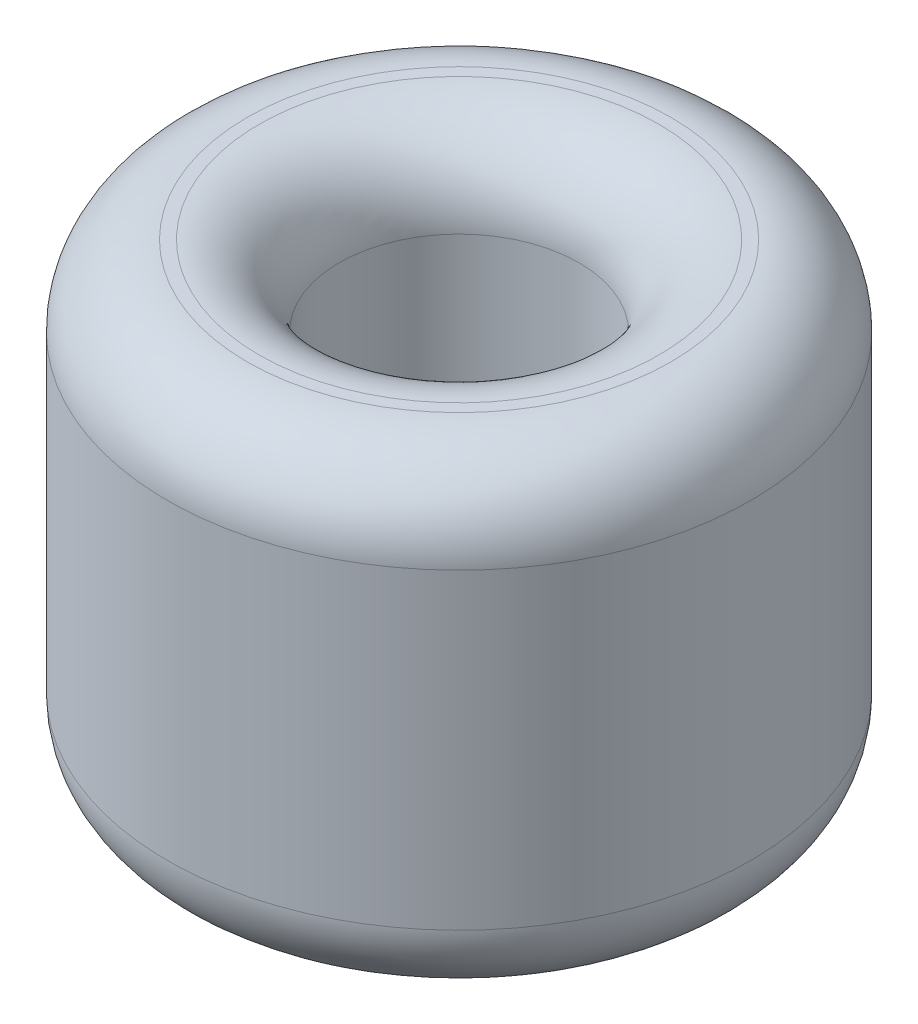
ISO-10303-21;
HEADER;
FILE_DESCRIPTION(('STEP AP214'),'2;1');
FILE_NAME('part.step','',(''),(''),'','','');
FILE_SCHEMA(('AUTOMOTIVE_DESIGN { 1 0 10303 214 1 1 1 1 }'));
ENDSEC;
DATA;
#1=APPLICATION_CONTEXT('core data for automotive mechanical design processes');
#2=APPLICATION_PROTOCOL_DEFINITION('international standard','automotive_design',2000,#1);
#3=PRODUCT_CONTEXT('',#1,'mechanical');
#4=PRODUCT('Part','Part','',(#3));
#5=PRODUCT_RELATED_PRODUCT_CATEGORY('part','',(#4));
#6=PRODUCT_DEFINITION_FORMATION('','',#4);
#7=PRODUCT_DEFINITION_CONTEXT('part definition',#1,'design');
#8=PRODUCT_DEFINITION('design','',#6,#7);
#9=PRODUCT_DEFINITION_SHAPE('','',#8);
#10=(LENGTH_UNIT() NAMED_UNIT(*) SI_UNIT(.MILLI.,.METRE.));
#11=(NAMED_UNIT(*) PLANE_ANGLE_UNIT() SI_UNIT($,.RADIAN.));
#12=(NAMED_UNIT(*) SI_UNIT($,.STERADIAN.) SOLID_ANGLE_UNIT());
#13=UNCERTAINTY_MEASURE_WITH_UNIT(LENGTH_MEASURE(1.E-05),#10,'distance_accuracy_value','');
#14=(GEOMETRIC_REPRESENTATION_CONTEXT(3) GLOBAL_UNCERTAINTY_ASSIGNED_CONTEXT((#13)) GLOBAL_UNIT_ASSIGNED_CONTEXT((#10,
#11,#12)) REPRESENTATION_CONTEXT('',''));
#15=CARTESIAN_POINT('',(0.,0.,0.));
#16=DIRECTION('',(0.,0.,1.));
#17=DIRECTION('',(1.,0.,0.));
#18=AXIS2_PLACEMENT_3D('',#15,#16,#17);
#19=CARTESIAN_POINT('',(0.,4.9,0.));
#20=DIRECTION('',(0.,-1.,0.));
#21=DIRECTION('',(0.,0.,-1.));
#22=AXIS2_PLACEMENT_3D('',#19,#20,#21);
#23=TOROIDAL_SURFACE('',#22,2.5,1.);
#24=CARTESIAN_POINT('',(0.,4.9,0.));
#25=DIRECTION('',(0.,-1.,0.));
#26=DIRECTION('',(0.,0.,-1.));
#27=AXIS2_PLACEMENT_3D('',#24,#25,#26);
#28=CIRCLE('',#27,1.5);
#29=CARTESIAN_POINT('',(0.,4.9,-1.5));
#30=VERTEX_POINT('',#29);
#31=EDGE_CURVE('E10',#30,#30,#28,.T.);
#32=ORIENTED_EDGE('',*,*,#31,.T.);
#33=EDGE_LOOP('',(#32));
#34=FACE_BOUND('',#33,.T.);
#35=CARTESIAN_POINT('',(0.,5.9,0.));
#36=DIRECTION('',(0.,-1.,0.));
#37=DIRECTION('',(0.,0.,-1.));
#38=AXIS2_PLACEMENT_3D('',#35,#36,#37);
#39=CIRCLE('',#38,2.5);
#40=CARTESIAN_POINT('',(0.,5.9,-2.5));
#41=VERTEX_POINT('',#40);
#42=EDGE_CURVE('E59',#41,#41,#39,.T.);
#43=ORIENTED_EDGE('',*,*,#42,.F.);
#44=EDGE_LOOP('',(#43));
#45=FACE_BOUND('',#44,.T.);
#46=ADVANCED_FACE('F31',(#34,#45),#23,.T.);
#47=CARTESIAN_POINT('',(0.,5.90291250794976,0.));
#48=DIRECTION('',(0.,-1.,0.));
#49=DIRECTION('',(0.,0.,-1.));
#50=AXIS2_PLACEMENT_3D('',#47,#48,#49);
#51=CYLINDRICAL_SURFACE('',#50,1.5);
#52=CARTESIAN_POINT('',(0.,1.,0.));
#53=DIRECTION('',(0.,-1.,0.));
#54=DIRECTION('',(0.,0.,-1.));
#55=AXIS2_PLACEMENT_3D('',#52,#53,#54);
#56=CIRCLE('',#55,1.5);
#57=CARTESIAN_POINT('',(0.,1.,-1.5));
#58=VERTEX_POINT('',#57);
#59=EDGE_CURVE('E37',#58,#58,#56,.T.);
#60=ORIENTED_EDGE('',*,*,#59,.T.);
#61=EDGE_LOOP('',(#60));
#62=FACE_BOUND('',#61,.T.);
#63=ORIENTED_EDGE('',*,*,#31,.F.);
#64=EDGE_LOOP('',(#63));
#65=FACE_BOUND('',#64,.T.);
#66=ADVANCED_FACE('F67',(#62,#65),#51,.F.);
#67=CARTESIAN_POINT('',(0.,1.,0.));
#68=DIRECTION('',(0.,-1.,0.));
#69=DIRECTION('',(0.,0.,-1.));
#70=AXIS2_PLACEMENT_3D('',#67,#68,#69);
#71=TOROIDAL_SURFACE('',#70,2.5,1.);
#72=CARTESIAN_POINT('',(0.,0.,0.));
#73=DIRECTION('',(0.,-1.,0.));
#74=DIRECTION('',(0.,0.,-1.));
#75=AXIS2_PLACEMENT_3D('',#72,#73,#74);
#76=CIRCLE('',#75,2.5);
#77=CARTESIAN_POINT('',(0.,0.,-2.5));
#78=VERTEX_POINT('',#77);
#79=EDGE_CURVE('E41',#78,#78,#76,.T.);
#80=ORIENTED_EDGE('',*,*,#79,.T.);
#81=EDGE_LOOP('',(#80));
#82=FACE_BOUND('',#81,.T.);
#83=ORIENTED_EDGE('',*,*,#59,.F.);
#84=EDGE_LOOP('',(#83));
#85=FACE_BOUND('',#84,.T.);
#86=ADVANCED_FACE('F71',(#82,#85),#71,.T.);
#87=CARTESIAN_POINT('',(2.5,0.,0.));
#88=DIRECTION('',(0.,-1.,0.));
#89=DIRECTION('',(0.,0.,-1.));
#90=AXIS2_PLACEMENT_3D('',#87,#88,#89);
#91=PLANE('',#90);
#92=CARTESIAN_POINT('',(0.,0.,0.));
#93=DIRECTION('',(0.,-1.,0.));
#94=DIRECTION('',(0.,0.,-1.));
#95=AXIS2_PLACEMENT_3D('',#92,#93,#94);
#96=CIRCLE('',#95,2.65);
#97=CARTESIAN_POINT('',(0.,0.,-2.65));
#98=VERTEX_POINT('',#97);
#99=EDGE_CURVE('E45',#98,#98,#96,.T.);
#100=ORIENTED_EDGE('',*,*,#99,.T.);
#101=EDGE_LOOP('',(#100));
#102=FACE_BOUND('',#101,.T.);
#103=ORIENTED_EDGE('',*,*,#79,.F.);
#104=EDGE_LOOP('',(#103));
#105=FACE_BOUND('',#104,.T.);
#106=ADVANCED_FACE('F75',(#102,#105),#91,.T.);
#107=CARTESIAN_POINT('',(0.,1.,0.));
#108=DIRECTION('',(0.,-1.,0.));
#109=DIRECTION('',(0.,0.,-1.));
#110=AXIS2_PLACEMENT_3D('',#107,#108,#109);
#111=TOROIDAL_SURFACE('',#110,2.65,1.);
#112=CARTESIAN_POINT('',(0.,1.,0.));
#113=DIRECTION('',(0.,-1.,0.));
#114=DIRECTION('',(0.,0.,-1.));
#115=AXIS2_PLACEMENT_3D('',#112,#113,#114);
#116=CIRCLE('',#115,3.65);
#117=CARTESIAN_POINT('',(0.,1.,-3.65));
#118=VERTEX_POINT('',#117);
#119=EDGE_CURVE('E50',#118,#118,#116,.T.);
#120=ORIENTED_EDGE('',*,*,#119,.T.);
#121=EDGE_LOOP('',(#120));
#122=FACE_BOUND('',#121,.T.);
#123=ORIENTED_EDGE('',*,*,#99,.F.);
#124=EDGE_LOOP('',(#123));
#125=FACE_BOUND('',#124,.T.);
#126=ADVANCED_FACE('F82',(#122,#125),#111,.T.);
#127=CARTESIAN_POINT('',(0.,5.90291250794976,0.));
#128=DIRECTION('',(0.,-1.,0.));
#129=DIRECTION('',(0.,0.,-1.));
#130=AXIS2_PLACEMENT_3D('',#127,#128,#129);
#131=CYLINDRICAL_SURFACE('',#130,3.65);
#132=CARTESIAN_POINT('',(0.,4.9,0.));
#133=DIRECTION('',(0.,-1.,0.));
#134=DIRECTION('',(0.,0.,-1.));
#135=AXIS2_PLACEMENT_3D('',#132,#133,#134);
#136=CIRCLE('',#135,3.65);
#137=CARTESIAN_POINT('',(0.,4.9,-3.65));
#138=VERTEX_POINT('',#137);
#139=EDGE_CURVE('E53',#138,#138,#136,.T.);
#140=ORIENTED_EDGE('',*,*,#139,.T.);
#141=EDGE_LOOP('',(#140));
#142=FACE_BOUND('',#141,.T.);
#143=ORIENTED_EDGE('',*,*,#119,.F.);
#144=EDGE_LOOP('',(#143));
#145=FACE_BOUND('',#144,.T.);
#146=ADVANCED_FACE('F86',(#142,#145),#131,.T.);
#147=CARTESIAN_POINT('',(0.,4.9,0.));
#148=DIRECTION('',(0.,-1.,0.));
#149=DIRECTION('',(0.,0.,-1.));
#150=AXIS2_PLACEMENT_3D('',#147,#148,#149);
#151=TOROIDAL_SURFACE('',#150,2.65,1.);
#152=CARTESIAN_POINT('',(0.,5.9,0.));
#153=DIRECTION('',(0.,-1.,0.));
#154=DIRECTION('',(0.,0.,-1.));
#155=AXIS2_PLACEMENT_3D('',#152,#153,#154);
#156=CIRCLE('',#155,2.65);
#157=CARTESIAN_POINT('',(0.,5.9,-2.65));
#158=VERTEX_POINT('',#157);
#159=EDGE_CURVE('E56',#158,#158,#156,.T.);
#160=ORIENTED_EDGE('',*,*,#159,.T.);
#161=EDGE_LOOP('',(#160));
#162=FACE_BOUND('',#161,.T.);
#163=ORIENTED_EDGE('',*,*,#139,.F.);
#164=EDGE_LOOP('',(#163));
#165=FACE_BOUND('',#164,.T.);
#166=ADVANCED_FACE('F90',(#162,#165),#151,.T.);
#167=CARTESIAN_POINT('',(2.65,5.9,0.));
#168=DIRECTION('',(0.,1.,0.));
#169=DIRECTION('',(0.,0.,1.));
#170=AXIS2_PLACEMENT_3D('',#167,#168,#169);
#171=PLANE('',#170);
#172=ORIENTED_EDGE('',*,*,#42,.T.);
#173=EDGE_LOOP('',(#172));
#174=FACE_BOUND('',#173,.T.);
#175=ORIENTED_EDGE('',*,*,#159,.F.);
#176=EDGE_LOOP('',(#175));
#177=FACE_BOUND('',#176,.T.);
#178=ADVANCED_FACE('F63',(#174,#177),#171,.T.);
#179=CLOSED_SHELL('',(#46,#66,#86,#106,#126,#146,#166,#178));
#180=MANIFOLD_SOLID_BREP('B2',#179);
#181=ADVANCED_BREP_SHAPE_REPRESENTATION('',(#18,#180),#14);
#182=SHAPE_DEFINITION_REPRESENTATION(#9,#181);
ENDSEC;
END-ISO-10303-21;
